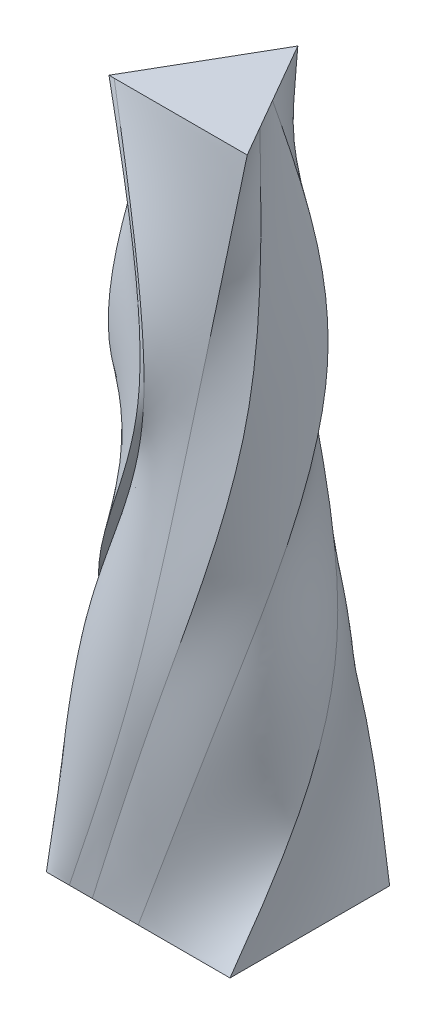
ISO-10303-21;
HEADER;
FILE_DESCRIPTION(('STEP AP214'),'2;1');
FILE_NAME('part.step','',(''),(''),'','','');
FILE_SCHEMA(('AUTOMOTIVE_DESIGN { 1 0 10303 214 1 1 1 1 }'));
ENDSEC;
DATA;
#1=APPLICATION_CONTEXT('core data for automotive mechanical design processes');
#2=APPLICATION_PROTOCOL_DEFINITION('international standard','automotive_design',2000,#1);
#3=PRODUCT_CONTEXT('',#1,'mechanical');
#4=PRODUCT('Part','Part','',(#3));
#5=PRODUCT_RELATED_PRODUCT_CATEGORY('part','',(#4));
#6=PRODUCT_DEFINITION_FORMATION('','',#4);
#7=PRODUCT_DEFINITION_CONTEXT('part definition',#1,'design');
#8=PRODUCT_DEFINITION('design','',#6,#7);
#9=PRODUCT_DEFINITION_SHAPE('','',#8);
#10=(LENGTH_UNIT() NAMED_UNIT(*) SI_UNIT(.MILLI.,.METRE.));
#11=(NAMED_UNIT(*) PLANE_ANGLE_UNIT() SI_UNIT($,.RADIAN.));
#12=(NAMED_UNIT(*) SI_UNIT($,.STERADIAN.) SOLID_ANGLE_UNIT());
#13=UNCERTAINTY_MEASURE_WITH_UNIT(LENGTH_MEASURE(1.E-05),#10,'distance_accuracy_value','');
#14=(GEOMETRIC_REPRESENTATION_CONTEXT(3) GLOBAL_UNCERTAINTY_ASSIGNED_CONTEXT((#13)) GLOBAL_UNIT_ASSIGNED_CONTEXT((#10,
#11,#12)) REPRESENTATION_CONTEXT('',''));
#15=CARTESIAN_POINT('',(0.,0.,0.));
#16=DIRECTION('',(0.,0.,1.));
#17=DIRECTION('',(1.,0.,0.));
#18=AXIS2_PLACEMENT_3D('',#15,#16,#17);
#19=CARTESIAN_POINT('',(0.,300.,0.));
#20=DIRECTION('',(0.,1.,0.));
#21=DIRECTION('',(0.,0.,1.));
#22=AXIS2_PLACEMENT_3D('',#19,#20,#21);
#23=PLANE('',#22);
#24=DIRECTION('',(1.,0.,0.));
#25=VECTOR('',#24,1.);
#26=CARTESIAN_POINT('',(-30.4293232964208,300.,17.5683779964472));
#27=LINE('',#26,#25);
#28=CARTESIAN_POINT('',(-30.4293232964208,300.,17.5683779964472));
#29=VERTEX_POINT('',#28);
#30=CARTESIAN_POINT('',(-28.1470310687837,300.,17.5683779964472));
#31=VERTEX_POINT('',#30);
#32=EDGE_CURVE('E78',#29,#31,#27,.T.);
#33=ORIENTED_EDGE('',*,*,#32,.T.);
#34=CARTESIAN_POINT('',(30.4293232964211,300.,17.5683779964468));
#35=VERTEX_POINT('',#34);
#36=EDGE_CURVE('E505',#31,#35,#27,.T.);
#37=ORIENTED_EDGE('',*,*,#36,.T.);
#38=DIRECTION('',(-0.500000000000004,0.,-0.866025403784436));
#39=VECTOR('',#38,1.);
#40=CARTESIAN_POINT('',(30.4293232964211,300.,17.5683779964468));
#41=LINE('',#40,#39);
#42=CARTESIAN_POINT('',(22.8219924723157,300.,4.39209449911165));
#43=VERTEX_POINT('',#42);
#44=EDGE_CURVE('E330',#35,#43,#41,.T.);
#45=ORIENTED_EDGE('',*,*,#44,.T.);
#46=CARTESIAN_POINT('',(15.2146616482104,300.,-8.78418899822345));
#47=VERTEX_POINT('',#46);
#48=EDGE_CURVE('E86',#43,#47,#41,.T.);
#49=ORIENTED_EDGE('',*,*,#48,.T.);
#50=CARTESIAN_POINT('',(-2.39391839684799E-13,300.,-35.1367559928937));
#51=VERTEX_POINT('',#50);
#52=EDGE_CURVE('E354',#47,#51,#41,.T.);
#53=ORIENTED_EDGE('',*,*,#52,.T.);
#54=DIRECTION('',(-0.499999999999992,0.,0.866025403784443));
#55=VECTOR('',#54,1.);
#56=CARTESIAN_POINT('',(-2.39391839684799E-13,300.,-35.1367559928937));
#57=LINE('',#56,#55);
#58=CARTESIAN_POINT('',(-10.1431077654738,300.,-17.5683779964467));
#59=VERTEX_POINT('',#58);
#60=EDGE_CURVE('E12',#51,#59,#57,.T.);
#61=ORIENTED_EDGE('',*,*,#60,.T.);
#62=CARTESIAN_POINT('',(-20.2862155309473,300.,2.56739074444567E-13));
#63=VERTEX_POINT('',#62);
#64=EDGE_CURVE('E70',#59,#63,#57,.T.);
#65=ORIENTED_EDGE('',*,*,#64,.T.);
#66=EDGE_CURVE('E499',#63,#29,#57,.T.);
#67=ORIENTED_EDGE('',*,*,#66,.T.);
#68=EDGE_LOOP('',(#33,#37,#45,#49,#53,#61,#65,#67));
#69=FACE_BOUND('',#68,.T.);
#70=ADVANCED_FACE('F59',(#69),#23,.T.);
#71=CARTESIAN_POINT('',(0.,0.,0.));
#72=DIRECTION('',(0.,1.,0.));
#73=DIRECTION('',(0.,0.,1.));
#74=AXIS2_PLACEMENT_3D('',#71,#72,#73);
#75=PLANE('',#74);
#76=DIRECTION('',(0.,0.,-1.));
#77=VECTOR('',#76,1.);
#78=CARTESIAN_POINT('',(40.4276188644105,0.,-35.1367559928937));
#79=LINE('',#78,#77);
#80=CARTESIAN_POINT('',(40.4276188644105,0.,35.1367559928937));
#81=VERTEX_POINT('',#80);
#82=CARTESIAN_POINT('',(40.4276188644105,0.,-35.1367559928937));
#83=VERTEX_POINT('',#82);
#84=EDGE_CURVE('E136',#81,#83,#79,.T.);
#85=ORIENTED_EDGE('',*,*,#84,.F.);
#86=DIRECTION('',(1.,0.,0.));
#87=VECTOR('',#86,1.);
#88=CARTESIAN_POINT('',(-40.4276188644105,0.,35.1367559928937));
#89=LINE('',#88,#87);
#90=CARTESIAN_POINT('',(0.,0.,35.1367559928937));
#91=VERTEX_POINT('',#90);
#92=EDGE_CURVE('E159',#91,#81,#89,.T.);
#93=ORIENTED_EDGE('',*,*,#92,.F.);
#94=CARTESIAN_POINT('',(-20.2138094322052,0.,35.1367559928937));
#95=VERTEX_POINT('',#94);
#96=EDGE_CURVE('E415',#95,#91,#89,.T.);
#97=ORIENTED_EDGE('',*,*,#96,.F.);
#98=CARTESIAN_POINT('',(-30.3207141483079,0.,35.1367559928937));
#99=VERTEX_POINT('',#98);
#100=EDGE_CURVE('E434',#99,#95,#89,.T.);
#101=ORIENTED_EDGE('',*,*,#100,.F.);
#102=CARTESIAN_POINT('',(-40.4276188644105,0.,35.1367559928937));
#103=VERTEX_POINT('',#102);
#104=EDGE_CURVE('E294',#103,#99,#89,.T.);
#105=ORIENTED_EDGE('',*,*,#104,.F.);
#106=DIRECTION('',(0.,0.,1.));
#107=VECTOR('',#106,1.);
#108=CARTESIAN_POINT('',(-40.4276188644105,0.,-35.1367559928937));
#109=LINE('',#108,#107);
#110=CARTESIAN_POINT('',(-40.4276188644105,0.,-35.1367559928937));
#111=VERTEX_POINT('',#110);
#112=EDGE_CURVE('E547',#111,#103,#109,.T.);
#113=ORIENTED_EDGE('',*,*,#112,.F.);
#114=DIRECTION('',(-1.,0.,0.));
#115=VECTOR('',#114,1.);
#116=CARTESIAN_POINT('',(-40.4276188644105,0.,-35.1367559928937));
#117=LINE('',#116,#115);
#118=CARTESIAN_POINT('',(0.,0.,-35.1367559928937));
#119=VERTEX_POINT('',#118);
#120=EDGE_CURVE('E139',#119,#111,#117,.T.);
#121=ORIENTED_EDGE('',*,*,#120,.F.);
#122=EDGE_CURVE('E131',#83,#119,#117,.T.);
#123=ORIENTED_EDGE('',*,*,#122,.F.);
#124=EDGE_LOOP('',(#85,#93,#97,#101,#105,#113,#121,#123));
#125=FACE_BOUND('',#124,.T.);
#126=ADVANCED_FACE('F134',(#125),#75,.F.);
#127=CARTESIAN_POINT('',(-40.4276188644105,0.,35.1367559928937));
#128=CARTESIAN_POINT('',(-43.8053402258569,33.5499719958289,25.0502257336181));
#129=CARTESIAN_POINT('',(-50.6027444606396,101.066708078416,4.75186001250216));
#130=CARTESIAN_POINT('',(21.7624046226934,197.09049255232,45.6886245688639));
#131=CARTESIAN_POINT('',(-11.7740665819999,266.240177083769,26.7933229815175));
#132=CARTESIAN_POINT('',(-28.1470310687837,300.,17.5683779964472));
#133=CARTESIAN_POINT('',(-39.5853768047353,0.,35.1367559928937));
#134=CARTESIAN_POINT('',(-42.4105000082445,33.5499719958289,27.242958904826));
#135=CARTESIAN_POINT('',(-48.0958429872443,101.066708078416,11.3572999018671));
#136=CARTESIAN_POINT('',(21.6850121673204,197.09049255232,43.0729643908746));
#137=CARTESIAN_POINT('',(-8.5194406992081,266.240177083769,25.9352465354432));
#138=CARTESIAN_POINT('',(-23.2656682050166,300.,17.5683779964471));
#139=CARTESIAN_POINT('',(-37.9008926853849,0.,35.1367559928937));
#140=CARTESIAN_POINT('',(-39.0030385483316,33.5499719958288,31.2071557101047));
#141=CARTESIAN_POINT('',(-41.2210222581939,101.066708078416,23.2991376278212));
#142=CARTESIAN_POINT('',(21.0876159347266,197.09049255232,38.1434640313594));
#143=CARTESIAN_POINT('',(-2.15538912179847,266.24017708377,24.3181067460284));
#144=CARTESIAN_POINT('',(-13.5029424774825,300.,17.5683779964471));
#145=CARTESIAN_POINT('',(-35.3741665063591,0.,35.1367559928936));
#146=CARTESIAN_POINT('',(-32.4624064111252,33.5499719958289,35.6461743453816));
#147=CARTESIAN_POINT('',(-26.6027133565331,101.066708078416,36.671339566528));
#148=CARTESIAN_POINT('',(19.1673944609987,197.09049255232,31.8291069325555));
#149=CARTESIAN_POINT('',(7.05471976836362,266.240177083769,22.2466598722412));
#150=CARTESIAN_POINT('',(1.14114611381868,300.,17.5683779964469));
#151=CARTESIAN_POINT('',(-32.8474403273336,0.,35.1367559928937));
#152=CARTESIAN_POINT('',(-24.9162374533098,33.5499719958287,38.3344484467875));
#153=CARTESIAN_POINT('',(-8.95530218548026,101.066708078416,44.7695583631138));
#154=CARTESIAN_POINT('',(16.5267527031401,197.09049255232,26.7690767252997));
#155=CARTESIAN_POINT('',(16.028492271143,266.24017708377,20.5866993109239));
#156=CARTESIAN_POINT('',(15.7852347051199,300.,17.5683779964469));
#157=CARTESIAN_POINT('',(-31.1629562079831,0.,35.1367559928937));
#158=CARTESIAN_POINT('',(-19.4977023521787,33.5499719958289,38.7971561843239));
#159=CARTESIAN_POINT('',(3.9777230823536,101.066708078416,46.1634298048257));
#160=CARTESIAN_POINT('',(14.4885159022849,197.09049255232,24.3482301488806));
#161=CARTESIAN_POINT('',(21.9198710737873,266.240177083769,19.7925321464485));
#162=CARTESIAN_POINT('',(25.547960432654,300.,17.5683779964468));
#163=CARTESIAN_POINT('',(-30.3207141483079,0.,35.1367559928937));
#164=CARTESIAN_POINT('',(-16.7621463737542,33.5499719958289,38.6555633103703));
#165=CARTESIAN_POINT('',(10.5234275816046,101.066708078416,45.7368921713626));
#166=CARTESIAN_POINT('',(13.4505630680709,197.09049255232,23.4050058262889));
#167=CARTESIAN_POINT('',(24.8593817734023,266.240177083769,19.4831041170007));
#168=CARTESIAN_POINT('',(30.4293232964211,300.,17.5683779964468));
#169=B_SPLINE_SURFACE_WITH_KNOTS('',3,3,((#127,#128,#129,#130,#131,#132),(#133,#134,#135,#136,
#137,#138),(#139,#140,#141,#142,#143,#144),(#145,#146,#147,#148,#149,#150),(#151,#152,#153,#154,
#155,#156),(#157,#158,#159,#160,#161,#162),(#163,#164,#165,#166,#167,#168)),.UNSPECIFIED.,.F.,
.F.,.F.,(4,1,1,1,4),(4,1,1,4),(0.,0.25,0.5,0.75,1.),(0.,0.335771666112832,0.675714631528431,1.),.UNSPECIFIED.);
#170=CARTESIAN_POINT('',(-30.3207141483079,0.,35.1367559928937));
#171=CARTESIAN_POINT('',(-16.7621463737542,33.5499719958289,38.6555633103703));
#172=CARTESIAN_POINT('',(10.5234275816046,101.066708078416,45.7368921713626));
#173=CARTESIAN_POINT('',(13.4505630680709,197.09049255232,23.4050058262889));
#174=CARTESIAN_POINT('',(24.8593817734023,266.240177083769,19.4831041170007));
#175=CARTESIAN_POINT('',(30.4293232964211,300.,17.5683779964468));
#176=B_SPLINE_CURVE_WITH_KNOTS('',3,(#170,#171,#172,#173,#174,#175),.UNSPECIFIED.,.F.,.F.,(4,1,
1,4),(0.,0.335771666112832,0.675714631528431,1.),.UNSPECIFIED.);
#177=EDGE_CURVE('E283',#99,#35,#176,.T.);
#178=CARTESIAN_POINT('',(-40.4276188644105,0.,35.1367559928937));
#179=CARTESIAN_POINT('',(-43.8053402258569,33.5499719958289,25.0502257336181));
#180=CARTESIAN_POINT('',(-50.6027444606396,101.066708078416,4.75186001250216));
#181=CARTESIAN_POINT('',(21.7624046226934,197.09049255232,45.6886245688639));
#182=CARTESIAN_POINT('',(-11.7740665819999,266.240177083769,26.7933229815175));
#183=CARTESIAN_POINT('',(-28.1470310687837,300.,17.5683779964472));
#184=B_SPLINE_CURVE_WITH_KNOTS('',3,(#178,#179,#180,#181,#182,#183),.UNSPECIFIED.,.F.,.F.,(4,1,
1,4),(0.,0.335771666112832,0.675714631528431,1.),.UNSPECIFIED.);
#185=EDGE_CURVE('E146',#31,#103,#184,.F.);
#186=ORIENTED_EDGE('',*,*,#104,.T.);
#187=ORIENTED_EDGE('',*,*,#177,.T.);
#188=ORIENTED_EDGE('',*,*,#36,.F.);
#189=ORIENTED_EDGE('',*,*,#185,.T.);
#190=EDGE_LOOP('',(#186,#187,#188,#189));
#191=FACE_BOUND('',#190,.T.);
#192=ADVANCED_FACE('F300',(#191),#169,.T.);
#193=CARTESIAN_POINT('',(-30.3207141483079,0.,35.1367559928937));
#194=CARTESIAN_POINT('',(-16.7621463737542,33.5499719958289,38.6555633103703));
#195=CARTESIAN_POINT('',(10.5234275816046,101.066708078416,45.7368921713626));
#196=CARTESIAN_POINT('',(13.4505630680709,197.09049255232,23.4050058262889));
#197=CARTESIAN_POINT('',(24.8593817734023,266.240177083769,19.4831041170007));
#198=CARTESIAN_POINT('',(30.4293232964211,300.,17.5683779964468));
#199=CARTESIAN_POINT('',(-29.4784720886326,0.,35.1367559928937));
#200=CARTESIAN_POINT('',(-15.9834279311039,33.5499719958289,38.6747879547878));
#201=CARTESIAN_POINT('',(11.1743096348172,101.066708078416,45.7948049328247));
#202=CARTESIAN_POINT('',(15.2727908657445,197.09049255232,22.6368708377133));
#203=CARTESIAN_POINT('',(25.0311933418042,266.240177083769,18.4933016101397));
#204=CARTESIAN_POINT('',(29.795379061079,300.,16.4703543716688));
#205=CARTESIAN_POINT('',(-27.7939879692822,0.,35.1367559928937));
#206=CARTESIAN_POINT('',(-14.43011458404,33.5499719958289,38.68271965563));
#207=CARTESIAN_POINT('',(12.46365189972,101.066708078416,45.8186985710572));
#208=CARTESIAN_POINT('',(18.9202007841231,197.09049255232,21.1224652905483));
#209=CARTESIAN_POINT('',(25.3757856545846,266.24017708377,16.5208692989484));
#210=CARTESIAN_POINT('',(28.5274905903947,300.,14.274307122113));
#211=CARTESIAN_POINT('',(-25.2672617902565,0.,35.1367559928936));
#212=CARTESIAN_POINT('',(-12.1169278597369,33.5499719958289,38.6041099294889));
#213=CARTESIAN_POINT('',(14.3471069089112,101.066708078416,45.581892822158));
#214=CARTESIAN_POINT('',(24.403340111553,197.09049255232,18.9157012173381));
#215=CARTESIAN_POINT('',(25.8966187864796,266.240177083769,13.5834932137739));
#216=CARTESIAN_POINT('',(26.6256578843684,300.,10.9802362477792));
#217=CARTESIAN_POINT('',(-22.7405356112309,0.,35.1367559928937));
#218=CARTESIAN_POINT('',(-9.8249371133096,33.5499719958289,38.4360384125176));
#219=CARTESIAN_POINT('',(16.1667106663436,101.066708078416,45.0755903148371));
#220=CARTESIAN_POINT('',(29.9016653696131,197.09049255232,16.7730323492441));
#221=CARTESIAN_POINT('',(26.4224337158936,266.240177083769,10.6671437842329));
#222=CARTESIAN_POINT('',(24.7238251783421,300.,7.68616537344543));
#223=CARTESIAN_POINT('',(-21.0560514918805,0.,35.1367559928937));
#224=CARTESIAN_POINT('',(-8.31401572199709,33.5499719958289,38.2650465316993));
#225=CARTESIAN_POINT('',(17.328350427729,101.066708078416,44.5604904362263));
#226=CARTESIAN_POINT('',(33.5794471492516,197.09049255232,15.3868172123114));
#227=CARTESIAN_POINT('',(26.776989623712,266.240177083769,8.73676478430828));
#228=CARTESIAN_POINT('',(23.4559367076578,300.,5.49011812388958));
#229=CARTESIAN_POINT('',(-20.2138094322052,0.,35.1367559928937));
#230=CARTESIAN_POINT('',(-7.56355858318109,33.5499719958289,38.1649887883431));
#231=CARTESIAN_POINT('',(17.8940974785967,101.066708078416,44.2590741864594));
#232=CARTESIAN_POINT('',(35.4219228544318,197.09049255232,14.704142497224));
#233=CARTESIAN_POINT('',(26.955443588806,266.240177083769,7.77499781829175));
#234=CARTESIAN_POINT('',(22.8219924723157,300.,4.39209449911165));
#235=B_SPLINE_SURFACE_WITH_KNOTS('',3,3,((#193,#194,#195,#196,#197,#198),(#199,#200,#201,#202,
#203,#204),(#205,#206,#207,#208,#209,#210),(#211,#212,#213,#214,#215,#216),(#217,#218,#219,#220,
#221,#222),(#223,#224,#225,#226,#227,#228),(#229,#230,#231,#232,#233,#234)),.UNSPECIFIED.,.F.,
.F.,.F.,(4,1,1,1,4),(4,1,1,4),(0.,0.25,0.5,0.75,1.),(0.,0.335771666112832,0.675714631528431,1.),.UNSPECIFIED.);
#236=CARTESIAN_POINT('',(-20.2138094322052,0.,35.1367559928937));
#237=CARTESIAN_POINT('',(-7.56355858318109,33.5499719958289,38.1649887883431));
#238=CARTESIAN_POINT('',(17.8940974785967,101.066708078416,44.2590741864594));
#239=CARTESIAN_POINT('',(35.4219228544318,197.09049255232,14.704142497224));
#240=CARTESIAN_POINT('',(26.955443588806,266.240177083769,7.77499781829175));
#241=CARTESIAN_POINT('',(22.8219924723157,300.,4.39209449911165));
#242=B_SPLINE_CURVE_WITH_KNOTS('',3,(#236,#237,#238,#239,#240,#241),.UNSPECIFIED.,.F.,.F.,(4,1,
1,4),(0.,0.335771666112832,0.675714631528431,1.),.UNSPECIFIED.);
#243=EDGE_CURVE('E404',#95,#43,#242,.T.);
#244=ORIENTED_EDGE('',*,*,#100,.T.);
#245=ORIENTED_EDGE('',*,*,#243,.T.);
#246=ORIENTED_EDGE('',*,*,#44,.F.);
#247=ORIENTED_EDGE('',*,*,#177,.F.);
#248=EDGE_LOOP('',(#244,#245,#246,#247));
#249=FACE_BOUND('',#248,.T.);
#250=ADVANCED_FACE('F255',(#249),#235,.T.);
#251=CARTESIAN_POINT('',(-40.4276188644105,0.,-35.1367559928937));
#252=CARTESIAN_POINT('',(-44.1756524121262,33.5499719958289,-16.9417704246869));
#253=CARTESIAN_POINT('',(-51.7182814164444,101.066708078416,19.6742374452399));
#254=CARTESIAN_POINT('',(20.3455507064214,197.09049255232,43.4591736619814));
#255=CARTESIAN_POINT('',(-13.7724487525273,266.240177083769,26.0619438341142));
#256=CARTESIAN_POINT('',(-30.4293232964208,300.,17.5683779964472));
#257=CARTESIAN_POINT('',(-40.4276188644105,0.,-29.2806299940781));
#258=CARTESIAN_POINT('',(-44.1479621055965,33.5499719958289,-13.4408275411091));
#259=CARTESIAN_POINT('',(-51.6348664995263,101.066708078416,18.4355556031268));
#260=CARTESIAN_POINT('',(20.4658923372921,197.09049255232,43.6438078404272));
#261=CARTESIAN_POINT('',(-13.6051720689918,266.240177083769,26.1225137204464));
#262=CARTESIAN_POINT('',(-30.2391322774511,300.,17.5683779964472));
#263=CARTESIAN_POINT('',(-40.4276188644105,0.,-17.5683779964468));
#264=CARTESIAN_POINT('',(-44.091099548199,33.5499719958289,-6.4399927808854));
#265=CARTESIAN_POINT('',(-51.4635724224463,101.066708078416,15.9550258414204));
#266=CARTESIAN_POINT('',(20.7055138549588,197.09049255232,44.0138291948193));
#267=CARTESIAN_POINT('',(-13.2709670107684,266.24017708377,26.2439005165678));
#268=CARTESIAN_POINT('',(-29.8587502395116,300.,17.5683779964472));
#269=CARTESIAN_POINT('',(-40.4276188644104,0.,0.));
#270=CARTESIAN_POINT('',(-44.0011290812323,33.5499719958289,4.05866000006692));
#271=CARTESIAN_POINT('',(-51.1925433163198,101.066708078416,12.2264008288086));
#272=CARTESIAN_POINT('',(21.0615955433239,197.09049255232,44.5707235463016));
#273=CARTESIAN_POINT('',(-12.7707585955594,266.240177083769,26.4265916512877));
#274=CARTESIAN_POINT('',(-29.2881771826022,300.,17.5683779964471));
#275=CARTESIAN_POINT('',(-40.4276188644105,0.,17.5683779964468));
#276=CARTESIAN_POINT('',(-43.9062511855392,33.5499719958289,14.5552670830495));
#277=CARTESIAN_POINT('',(-50.9067309589113,101.066708078416,8.49161330853348));
#278=CARTESIAN_POINT('',(21.4141612876429,197.09049255232,45.1290835450707));
#279=CARTESIAN_POINT('',(-12.2717035980601,266.240177083769,26.6097635967131));
#280=CARTESIAN_POINT('',(-28.717604125693,300.,17.5683779964472));
#281=CARTESIAN_POINT('',(-40.4276188644105,0.,29.2806299940781));
#282=CARTESIAN_POINT('',(-43.8395737706886,33.5499719958289,21.5520104473334));
#283=CARTESIAN_POINT('',(-50.7058703792672,101.066708078416,5.99875853149997));
#284=CARTESIAN_POINT('',(21.6467509172175,197.09049255232,45.5020361940359));
#285=CARTESIAN_POINT('',(-11.9398053752559,266.240177083769,26.7321120142449));
#286=CARTESIAN_POINT('',(-28.3372220877535,300.,17.5683779964472));
#287=CARTESIAN_POINT('',(-40.4276188644105,0.,35.1367559928937));
#288=CARTESIAN_POINT('',(-43.8053402258569,33.5499719958289,25.0502257336181));
#289=CARTESIAN_POINT('',(-50.6027444606396,101.066708078416,4.75186001250216));
#290=CARTESIAN_POINT('',(21.7624046226934,197.09049255232,45.6886245688639));
#291=CARTESIAN_POINT('',(-11.7740665819999,266.240177083769,26.7933229815175));
#292=CARTESIAN_POINT('',(-28.1470310687837,300.,17.5683779964472));
#293=B_SPLINE_SURFACE_WITH_KNOTS('',3,3,((#251,#252,#253,#254,#255,#256),(#257,#258,#259,#260,
#261,#262),(#263,#264,#265,#266,#267,#268),(#269,#270,#271,#272,#273,#274),(#275,#276,#277,#278,
#279,#280),(#281,#282,#283,#284,#285,#286),(#287,#288,#289,#290,#291,#292)),.UNSPECIFIED.,.F.,
.F.,.F.,(4,1,1,1,4),(4,1,1,4),(0.,0.25,0.5,0.75,1.),(0.,0.335771666112832,0.675714631528431,1.),.UNSPECIFIED.);
#294=CARTESIAN_POINT('',(-40.4276188644105,0.,-35.1367559928937));
#295=CARTESIAN_POINT('',(-44.1756524121262,33.5499719958289,-16.9417704246869));
#296=CARTESIAN_POINT('',(-51.7182814164444,101.066708078416,19.6742374452399));
#297=CARTESIAN_POINT('',(20.3455507064214,197.09049255232,43.4591736619814));
#298=CARTESIAN_POINT('',(-13.7724487525273,266.240177083769,26.0619438341142));
#299=CARTESIAN_POINT('',(-30.4293232964208,300.,17.5683779964472));
#300=B_SPLINE_CURVE_WITH_KNOTS('',3,(#294,#295,#296,#297,#298,#299),.UNSPECIFIED.,.F.,.F.,(4,1,
1,4),(0.,0.335771666112832,0.675714631528431,1.),.UNSPECIFIED.);
#301=EDGE_CURVE('E171',#111,#29,#300,.T.);
#302=ORIENTED_EDGE('',*,*,#112,.T.);
#303=ORIENTED_EDGE('',*,*,#185,.F.);
#304=ORIENTED_EDGE('',*,*,#32,.F.);
#305=ORIENTED_EDGE('',*,*,#301,.F.);
#306=EDGE_LOOP('',(#302,#303,#304,#305));
#307=FACE_BOUND('',#306,.T.);
#308=ADVANCED_FACE('F242',(#307),#293,.T.);
#309=CARTESIAN_POINT('',(-20.2138094322052,0.,35.1367559928937));
#310=CARTESIAN_POINT('',(-7.56355858318109,33.5499719958289,38.1649887883431));
#311=CARTESIAN_POINT('',(17.8940974785967,101.066708078416,44.2590741864594));
#312=CARTESIAN_POINT('',(35.4219228544318,197.09049255232,14.704142497224));
#313=CARTESIAN_POINT('',(26.955443588806,266.240177083769,7.77499781829175));
#314=CARTESIAN_POINT('',(22.8219924723157,300.,4.39209449911165));
#315=CARTESIAN_POINT('',(-18.5293253128548,0.,35.1367559928937));
#316=CARTESIAN_POINT('',(-5.72299062160961,33.5499719958289,38.1940360001735));
#317=CARTESIAN_POINT('',(20.048772157852,101.066708078416,44.3465766761463));
#318=CARTESIAN_POINT('',(35.0770794180253,197.09049255232,10.575032716777));
#319=CARTESIAN_POINT('',(26.4163398790778,266.240177083769,5.68261580625546));
#320=CARTESIAN_POINT('',(22.1880482369736,300.,3.29407087433373));
#321=CARTESIAN_POINT('',(-15.160357074154,0.,35.1367559928937));
#322=CARTESIAN_POINT('',(-2.09372660816902,33.549971995829,38.1390349057648));
#323=CARTESIAN_POINT('',(24.2018613813017,101.066708078416,44.180890113031));
#324=CARTESIAN_POINT('',(34.4245563518082,197.09049255232,2.39784082547368));
#325=CARTESIAN_POINT('',(25.3503241760205,266.24017708377,1.52443319185574));
#326=CARTESIAN_POINT('',(20.9201597662894,300.,1.09802362477788));
#327=CARTESIAN_POINT('',(-10.1069047161026,0.,35.1367559928936));
#328=CARTESIAN_POINT('',(3.16518755862513,33.5499719958287,37.7384489670625));
#329=CARTESIAN_POINT('',(29.8742516224623,101.066708078416,42.9741558083892));
#330=CARTESIAN_POINT('',(33.5783026321382,197.09049255232,-9.64005443212486));
#331=CARTESIAN_POINT('',(23.7947778388372,266.240177083769,-4.63807977408668));
#332=CARTESIAN_POINT('',(19.0183270602631,300.,-2.1960472495559));
#333=CARTESIAN_POINT('',(-5.05345235805132,0.,35.1367559928937));
#334=CARTESIAN_POINT('',(8.209753747793,33.5499719958289,37.0409809883917));
#335=CARTESIAN_POINT('',(34.9009350807784,101.066708078416,40.8730872112788));
#336=CARTESIAN_POINT('',(32.8856192519917,197.09049255232,-21.4652475397833));
#337=CARTESIAN_POINT('',(22.2896107872621,266.240177083769,-10.7308150577335));
#338=CARTESIAN_POINT('',(17.1164943542367,300.,-5.49011812388968));
#339=CARTESIAN_POINT('',(-1.68448411935044,0.,35.1367559928937));
#340=CARTESIAN_POINT('',(11.4103218059809,33.5499719958289,36.3922158140453));
#341=CARTESIAN_POINT('',(37.7626107385385,101.066708078416,38.9187320632249));
#342=CARTESIAN_POINT('',(32.5402368648218,197.09049255232,-29.2170351312061));
#343=CARTESIAN_POINT('',(21.3243536554211,266.240177083769,-14.749442307542));
#344=CARTESIAN_POINT('',(15.8486058835525,300.,-7.68616537344553));
#345=CARTESIAN_POINT('',(0.,0.,35.1367559928937));
#346=CARTESIAN_POINT('',(12.9650924640506,33.5499719958289,36.0254203059173));
#347=CARTESIAN_POINT('',(39.0563430406674,101.066708078416,37.8137888296196));
#348=CARTESIAN_POINT('',(32.4001538811134,197.09049255232,-33.0625420450661));
#349=CARTESIAN_POINT('',(20.8524223265037,266.240177083769,-16.7487874098508));
#350=CARTESIAN_POINT('',(15.2146616482104,300.,-8.78418899822345));
#351=B_SPLINE_SURFACE_WITH_KNOTS('',3,3,((#309,#310,#311,#312,#313,#314),(#315,#316,#317,#318,
#319,#320),(#321,#322,#323,#324,#325,#326),(#327,#328,#329,#330,#331,#332),(#333,#334,#335,#336,
#337,#338),(#339,#340,#341,#342,#343,#344),(#345,#346,#347,#348,#349,#350)),.UNSPECIFIED.,.F.,
.F.,.F.,(4,1,1,1,4),(4,1,1,4),(0.,0.25,0.5,0.75,1.),(0.,0.335771666112832,0.675714631528431,1.),.UNSPECIFIED.);
#352=CARTESIAN_POINT('',(0.,0.,35.1367559928937));
#353=CARTESIAN_POINT('',(12.9650924640506,33.5499719958289,36.0254203059173));
#354=CARTESIAN_POINT('',(39.0563430406674,101.066708078416,37.8137888296196));
#355=CARTESIAN_POINT('',(32.4001538811134,197.09049255232,-33.0625420450661));
#356=CARTESIAN_POINT('',(20.8524223265037,266.240177083769,-16.7487874098508));
#357=CARTESIAN_POINT('',(15.2146616482104,300.,-8.78418899822345));
#358=B_SPLINE_CURVE_WITH_KNOTS('',3,(#352,#353,#354,#355,#356,#357),.UNSPECIFIED.,.F.,.F.,(4,1,
1,4),(0.,0.335771666112832,0.675714631528431,1.),.UNSPECIFIED.);
#359=EDGE_CURVE('E173',#91,#47,#358,.T.);
#360=ORIENTED_EDGE('',*,*,#96,.T.);
#361=ORIENTED_EDGE('',*,*,#359,.T.);
#362=ORIENTED_EDGE('',*,*,#48,.F.);
#363=ORIENTED_EDGE('',*,*,#243,.F.);
#364=EDGE_LOOP('',(#360,#361,#362,#363));
#365=FACE_BOUND('',#364,.T.);
#366=ADVANCED_FACE('F254',(#365),#351,.T.);
#367=CARTESIAN_POINT('',(0.,0.,35.1367559928937));
#368=CARTESIAN_POINT('',(12.9650924640506,33.5499719958289,36.0254203059173));
#369=CARTESIAN_POINT('',(39.0563430406674,101.066708078416,37.8137888296196));
#370=CARTESIAN_POINT('',(32.4001538811134,197.09049255232,-33.0625420450661));
#371=CARTESIAN_POINT('',(20.8524223265037,266.240177083769,-16.7487874098508));
#372=CARTESIAN_POINT('',(15.2146616482104,300.,-8.78418899822345));
#373=CARTESIAN_POINT('',(3.36896823870087,0.,35.1367559928937));
#374=CARTESIAN_POINT('',(16.4334183976483,33.5499719958289,34.6809314145583));
#375=CARTESIAN_POINT('',(42.7246186870385,101.066708078416,33.7636195384335));
#376=CARTESIAN_POINT('',(28.053630567424,197.09049255232,-33.7179664070249));
#377=CARTESIAN_POINT('',(18.5745769558078,266.240177083769,-18.4394279466944));
#378=CARTESIAN_POINT('',(13.9467731775262,300.,-10.9802362477793));
#379=CARTESIAN_POINT('',(10.1069047161026,0.,35.1367559928937));
#380=CARTESIAN_POINT('',(22.9271456599813,33.5499719958288,31.72468532734));
#381=CARTESIAN_POINT('',(48.7268937024132,101.066708078416,24.8581557621301));
#382=CARTESIAN_POINT('',(19.6779187836268,197.09049255232,-34.8373298427653));
#383=CARTESIAN_POINT('',(14.1229890168699,266.24017708377,-21.7578916036019));
#384=CARTESIAN_POINT('',(11.4109962361578,300.,-15.372330746891));
#385=CARTESIAN_POINT('',(20.2138094322052,0.,35.1367559928936));
#386=CARTESIAN_POINT('',(31.2927606718792,33.5499719958289,26.7746947430546));
#387=CARTESIAN_POINT('',(53.5882972229654,101.066708078416,9.94669015986141));
#388=CARTESIAN_POINT('',(8.09945726714271,197.09049255232,-36.1469562477127));
#389=CARTESIAN_POINT('',(7.76877462051807,266.240177083769,-26.6143979797535));
#390=CARTESIAN_POINT('',(7.60733082410508,300.,-21.9604724955586));
#391=CARTESIAN_POINT('',(30.3207141483079,0.,35.1367559928937));
#392=CARTESIAN_POINT('',(38.2371977351621,33.5499719958287,21.5952661653538));
#393=CARTESIAN_POINT('',(54.1685115706021,101.066708078416,-5.65593973624015));
#394=CARTESIAN_POINT('',(-2.46079646166299,197.09049255232,-37.2922010198657));
#395=CARTESIAN_POINT('',(1.74858684091425,266.24017708377,-31.4169783878244));
#396=CARTESIAN_POINT('',(3.80366541205243,300.,-28.5486142442261));
#397=CARTESIAN_POINT('',(37.0586506257096,0.,35.1367559928937));
#398=CARTESIAN_POINT('',(41.8885691002643,33.5499719958289,18.1801440913047));
#399=CARTESIAN_POINT('',(51.6084082401438,101.066708078416,-15.9437321002095));
#400=CARTESIAN_POINT('',(-8.80009267010288,197.09049255232,-38.082801190017));
#401=CARTESIAN_POINT('',(-2.03494786452752,266.240177083769,-34.6275901085706));
#402=CARTESIAN_POINT('',(1.26788847068398,300.,-32.9407087433378));
#403=CARTESIAN_POINT('',(40.4276188644105,0.,35.1367559928937));
#404=CARTESIAN_POINT('',(43.4619911023748,33.5499719958289,16.5297378753918));
#405=CARTESIAN_POINT('',(49.5684316559597,101.066708078416,-20.9154537831729));
#406=CARTESIAN_POINT('',(-11.7890056002207,197.09049255232,-38.5190500415832));
#407=CARTESIAN_POINT('',(-3.86742441289271,266.240177083769,-36.24632935464));
#408=CARTESIAN_POINT('',(-2.42861286636753E-13,300.,-35.1367559928937));
#409=B_SPLINE_SURFACE_WITH_KNOTS('',3,3,((#367,#368,#369,#370,#371,#372),(#373,#374,#375,#376,
#377,#378),(#379,#380,#381,#382,#383,#384),(#385,#386,#387,#388,#389,#390),(#391,#392,#393,#394,
#395,#396),(#397,#398,#399,#400,#401,#402),(#403,#404,#405,#406,#407,#408)),.UNSPECIFIED.,.F.,
.F.,.F.,(4,1,1,1,4),(4,1,1,4),(0.,0.25,0.5,0.75,1.),(0.,0.335771666112832,0.675714631528431,1.),.UNSPECIFIED.);
#410=CARTESIAN_POINT('',(40.4276188644105,0.,35.1367559928937));
#411=CARTESIAN_POINT('',(43.4619911023748,33.5499719958289,16.5297378753918));
#412=CARTESIAN_POINT('',(49.5684316559597,101.066708078416,-20.9154537831729));
#413=CARTESIAN_POINT('',(-11.7890056002207,197.09049255232,-38.5190500415832));
#414=CARTESIAN_POINT('',(-3.86742441289271,266.240177083769,-36.24632935464));
#415=CARTESIAN_POINT('',(-2.42861286636753E-13,300.,-35.1367559928937));
#416=B_SPLINE_CURVE_WITH_KNOTS('',3,(#410,#411,#412,#413,#414,#415),.UNSPECIFIED.,.F.,.F.,(4,1,
1,4),(0.,0.335771666112832,0.675714631528431,1.),.UNSPECIFIED.);
#417=EDGE_CURVE('E157',#81,#51,#416,.T.);
#418=ORIENTED_EDGE('',*,*,#92,.T.);
#419=ORIENTED_EDGE('',*,*,#417,.T.);
#420=ORIENTED_EDGE('',*,*,#52,.F.);
#421=ORIENTED_EDGE('',*,*,#359,.F.);
#422=EDGE_LOOP('',(#418,#419,#420,#421));
#423=FACE_BOUND('',#422,.T.);
#424=ADVANCED_FACE('F360',(#423),#409,.T.);
#425=CARTESIAN_POINT('',(40.4276188644105,0.,35.1367559928937));
#426=CARTESIAN_POINT('',(43.4619911023748,33.5499719958289,16.5297378753918));
#427=CARTESIAN_POINT('',(49.5684316559597,101.066708078416,-20.9154537831729));
#428=CARTESIAN_POINT('',(-11.7890056002208,197.09049255232,-38.5190500415832));
#429=CARTESIAN_POINT('',(-3.86742441289271,266.240177083769,-36.24632935464));
#430=CARTESIAN_POINT('',(-2.39391839684799E-13,300.,-35.1367559928937));
#431=CARTESIAN_POINT('',(40.4276188644105,0.,29.2806299940781));
#432=CARTESIAN_POINT('',(43.0975557022642,33.5499719958289,11.1892689563957));
#433=CARTESIAN_POINT('',(48.4705980660836,101.066708078416,-25.2182025225034));
#434=CARTESIAN_POINT('',(-15.1137306089929,197.09049255232,-35.6834882702523));
#435=CARTESIAN_POINT('',(-5.52608087351184,266.240177083769,-34.3323625647694));
#436=CARTESIAN_POINT('',(-0.845258980456368,300.,-33.6727244931897));
#437=CARTESIAN_POINT('',(40.4276188644105,0.,17.5683779964468));
#438=CARTESIAN_POINT('',(41.9157614582882,33.5499719958288,0.758280925925357));
#439=CARTESIAN_POINT('',(44.9105338764765,101.066708078416,-33.0707454462628));
#440=CARTESIAN_POINT('',(-21.438682080734,197.09049255232,-30.1914421195497));
#441=CARTESIAN_POINT('',(-8.73694091479185,266.24017708377,-30.5631759481689));
#442=CARTESIAN_POINT('',(-2.53577694136863,300.,-30.7446614937819));
#443=CARTESIAN_POINT('',(40.4276188644104,0.,0.));
#444=CARTESIAN_POINT('',(39.0090408740926,33.5499719958289,-13.9552478034516));
#445=CARTESIAN_POINT('',(36.1542618657298,101.066708078416,-42.0391097819323));
#446=CARTESIAN_POINT('',(-30.1136301877631,197.09049255232,-22.6217904784658));
#447=CARTESIAN_POINT('',(-13.2866943734466,266.240177083769,-25.1286727437806));
#448=CARTESIAN_POINT('',(-5.071553882737,300.,-26.3525669946702));
#449=CARTESIAN_POINT('',(40.4276188644105,0.,-17.5683779964468));
#450=CARTESIAN_POINT('',(35.1930321846985,33.5499719958287,-27.552719322737));
#451=CARTESIAN_POINT('',(24.6588294318771,101.066708078416,-47.6454376823653));
#452=CARTESIAN_POINT('',(-38.1371157310376,197.09049255232,-15.8517418314456));
#453=CARTESIAN_POINT('',(-17.6227332654459,266.24017708377,-19.956482090996));
#454=CARTESIAN_POINT('',(-7.60733082410541,300.,-21.9604724955584));
#455=CARTESIAN_POINT('',(40.4276188644105,0.,-29.2806299940781));
#456=CARTESIAN_POINT('',(32.192661730325,33.5499719958289,-35.7515929330245));
#457=CARTESIAN_POINT('',(15.6204443960574,101.066708078416,-48.773907735653));
#458=CARTESIAN_POINT('',(-43.1591420752687,197.09049255232,-11.9589016688701));
#459=CARTESIAN_POINT('',(-20.4061641734148,266.240177083769,-16.7119205776027));
#460=CARTESIAN_POINT('',(-9.29784878501766,300.,-19.0324094961506));
#461=CARTESIAN_POINT('',(40.4276188644105,0.,-35.1367559928937));
#462=CARTESIAN_POINT('',(30.6158421899494,33.5499719958289,-39.6039855718988));
#463=CARTESIAN_POINT('',(10.8703969087064,101.066708078416,-48.5939412280022));
#464=CARTESIAN_POINT('',(-45.6152503323677,197.09049255232,-10.1894772229574));
#465=CARTESIAN_POINT('',(-21.7798678784931,266.240177083769,-15.147703856537));
#466=CARTESIAN_POINT('',(-10.1431077654738,300.,-17.5683779964467));
#467=B_SPLINE_SURFACE_WITH_KNOTS('',3,3,((#425,#426,#427,#428,#429,#430),(#431,#432,#433,#434,
#435,#436),(#437,#438,#439,#440,#441,#442),(#443,#444,#445,#446,#447,#448),(#449,#450,#451,#452,
#453,#454),(#455,#456,#457,#458,#459,#460),(#461,#462,#463,#464,#465,#466)),.UNSPECIFIED.,.F.,
.F.,.F.,(4,1,1,1,4),(4,1,1,4),(0.,0.25,0.5,0.75,1.),(0.,0.335771666112832,0.675714631528431,1.),.UNSPECIFIED.);
#468=CARTESIAN_POINT('',(40.4276188644105,0.,-35.1367559928937));
#469=CARTESIAN_POINT('',(30.6158421899494,33.5499719958289,-39.6039855718988));
#470=CARTESIAN_POINT('',(10.8703969087064,101.066708078416,-48.5939412280022));
#471=CARTESIAN_POINT('',(-45.6152503323677,197.09049255232,-10.1894772229574));
#472=CARTESIAN_POINT('',(-21.7798678784931,266.240177083769,-15.147703856537));
#473=CARTESIAN_POINT('',(-10.1431077654738,300.,-17.5683779964467));
#474=B_SPLINE_CURVE_WITH_KNOTS('',3,(#468,#469,#470,#471,#472,#473),.UNSPECIFIED.,.F.,.F.,(4,1,
1,4),(0.,0.335771666112832,0.675714631528431,1.),.UNSPECIFIED.);
#475=EDGE_CURVE('E156',#83,#59,#474,.T.);
#476=ORIENTED_EDGE('',*,*,#84,.T.);
#477=ORIENTED_EDGE('',*,*,#475,.T.);
#478=ORIENTED_EDGE('',*,*,#60,.F.);
#479=ORIENTED_EDGE('',*,*,#417,.F.);
#480=EDGE_LOOP('',(#476,#477,#478,#479));
#481=FACE_BOUND('',#480,.T.);
#482=ADVANCED_FACE('F154',(#481),#467,.T.);
#483=CARTESIAN_POINT('',(40.4276188644105,0.,-35.1367559928937));
#484=CARTESIAN_POINT('',(30.6158421899494,33.5499719958289,-39.6039855718988));
#485=CARTESIAN_POINT('',(10.8703969087064,101.066708078416,-48.5939412280022));
#486=CARTESIAN_POINT('',(-45.6152503323677,197.09049255232,-10.1894772229574));
#487=CARTESIAN_POINT('',(-21.7798678784931,266.240177083769,-15.147703856537));
#488=CARTESIAN_POINT('',(-10.1431077654738,300.,-17.5683779964467));
#489=CARTESIAN_POINT('',(37.0586506257096,0.,-35.1367559928937));
#490=CARTESIAN_POINT('',(26.7533449683348,33.5499719958289,-40.2657497655276));
#491=CARTESIAN_POINT('',(6.01471059910576,101.066708078416,-50.5874549210256));
#492=CARTESIAN_POINT('',(-44.236929314692,197.09049255232,-5.70382440107775));
#493=CARTESIAN_POINT('',(-21.8956736836421,266.240177083769,-12.6924189412202));
#494=CARTESIAN_POINT('',(-10.9883667459299,300.,-16.1043464967428));
#495=CARTESIAN_POINT('',(30.3207141483079,0.,-35.1367559928937));
#496=CARTESIAN_POINT('',(19.0183516862133,33.5499719958288,-41.0720600407632));
#497=CARTESIAN_POINT('',(-3.72678275258314,101.066708078416,-53.0164025582396));
#498=CARTESIAN_POINT('',(-41.4731235771191,197.09049255232,2.89691856254533));
#499=CARTESIAN_POINT('',(-22.1249352164359,266.24017708377,-7.90341349050657));
#500=CARTESIAN_POINT('',(-12.6788847068422,300.,-13.176283497335));
#501=CARTESIAN_POINT('',(20.2138094322052,0.,-35.1367559928936));
#502=CARTESIAN_POINT('',(7.65680842640074,33.5499719958289,-40.83295068383));
#503=CARTESIAN_POINT('',(-17.6131895039429,101.066708078416,-52.2961040262768));
#504=CARTESIAN_POINT('',(-37.5000420293889,197.09049255232,14.7601966743466));
#505=CARTESIAN_POINT('',(-22.5254584244163,266.240177083769,-1.06037114415847));
#506=CARTESIAN_POINT('',(-15.2146616482105,300.,-8.7841889982232));
#507=CARTESIAN_POINT('',(10.1069047161026,0.,-35.1367559928937));
#508=CARTESIAN_POINT('',(-3.19284498999513,33.5499719958287,-39.24834612339));
#509=CARTESIAN_POINT('',(-29.9575675054926,101.066708078416,-47.5226047652453));
#510=CARTESIAN_POINT('',(-33.8937057055826,197.09049255232,25.6594901592899));
#511=CARTESIAN_POINT('',(-23.0462936824893,266.24017708377,5.46643268250529));
#512=CARTESIAN_POINT('',(-17.7504385895789,300.,-4.39209449911148));
#513=CARTESIAN_POINT('',(3.36896823870087,0.,-35.1367559928937));
#514=CARTESIAN_POINT('',(-9.90405858528346,33.5499719958289,-37.3636659916119));
#515=CARTESIAN_POINT('',(-36.6150033575612,101.066708078416,-41.8451509443214));
#516=CARTESIAN_POINT('',(-31.863390415857,197.09049255232,32.3322638691968));
#517=CARTESIAN_POINT('',(-23.516179315468,266.240177083769,9.62296109385025));
#518=CARTESIAN_POINT('',(-19.4409565504912,300.,-1.46403149970365));
#519=CARTESIAN_POINT('',(0.,0.,-35.1367559928937));
#520=CARTESIAN_POINT('',(-13.0840360156759,33.5499719958289,-36.2314365805649));
#521=CARTESIAN_POINT('',(-39.4146513340816,101.066708078416,-38.4343969985862));
#522=CARTESIAN_POINT('',(-30.9740630300797,197.09049255232,35.5326038552656));
#523=CARTESIAN_POINT('',(-23.792401187407,266.240177083769,11.656594649588));
#524=CARTESIAN_POINT('',(-20.2862155309473,300.,2.63677968348475E-13));
#525=B_SPLINE_SURFACE_WITH_KNOTS('',3,3,((#483,#484,#485,#486,#487,#488),(#489,#490,#491,#492,
#493,#494),(#495,#496,#497,#498,#499,#500),(#501,#502,#503,#504,#505,#506),(#507,#508,#509,#510,
#511,#512),(#513,#514,#515,#516,#517,#518),(#519,#520,#521,#522,#523,#524)),.UNSPECIFIED.,.F.,
.F.,.F.,(4,1,1,1,4),(4,1,1,4),(0.,0.25,0.5,0.75,1.),(0.,0.335771666112832,0.675714631528431,1.),.UNSPECIFIED.);
#526=CARTESIAN_POINT('',(0.,0.,-35.1367559928937));
#527=CARTESIAN_POINT('',(-13.0840360156759,33.5499719958289,-36.2314365805649));
#528=CARTESIAN_POINT('',(-39.4146513340816,101.066708078416,-38.4343969985862));
#529=CARTESIAN_POINT('',(-30.9740630300797,197.09049255232,35.5326038552656));
#530=CARTESIAN_POINT('',(-23.792401187407,266.240177083769,11.656594649588));
#531=CARTESIAN_POINT('',(-20.2862155309473,300.,2.63677968348475E-13));
#532=B_SPLINE_CURVE_WITH_KNOTS('',3,(#526,#527,#528,#529,#530,#531),.UNSPECIFIED.,.F.,.F.,(4,1,
1,4),(0.,0.335771666112832,0.675714631528431,1.),.UNSPECIFIED.);
#533=EDGE_CURVE('E167',#119,#63,#532,.T.);
#534=ORIENTED_EDGE('',*,*,#122,.T.);
#535=ORIENTED_EDGE('',*,*,#533,.T.);
#536=ORIENTED_EDGE('',*,*,#64,.F.);
#537=ORIENTED_EDGE('',*,*,#475,.F.);
#538=EDGE_LOOP('',(#534,#535,#536,#537));
#539=FACE_BOUND('',#538,.T.);
#540=ADVANCED_FACE('F164',(#539),#525,.T.);
#541=CARTESIAN_POINT('',(0.,0.,-35.1367559928937));
#542=CARTESIAN_POINT('',(-13.0840360156759,33.5499719958289,-36.2314365805649));
#543=CARTESIAN_POINT('',(-39.4146513340816,101.066708078416,-38.4343969985862));
#544=CARTESIAN_POINT('',(-30.9740630300797,197.09049255232,35.5326038552656));
#545=CARTESIAN_POINT('',(-23.792401187407,266.240177083769,11.656594649588));
#546=CARTESIAN_POINT('',(-20.2862155309473,300.,2.63677968348475E-13));
#547=CARTESIAN_POINT('',(-3.36896823870087,0.,-35.1367559928937));
#548=CARTESIAN_POINT('',(-16.6019217624508,33.5499719958289,-34.9041157120932));
#549=CARTESIAN_POINT('',(-43.2322221027086,101.066708078416,-34.435945054814));
#550=CARTESIAN_POINT('',(-26.0333351951264,197.09049255232,36.3938667014076));
#551=CARTESIAN_POINT('',(-22.7395470087541,266.240177083769,12.922885789743));
#552=CARTESIAN_POINT('',(-21.1314745114034,300.,1.46403149970417));
#553=CARTESIAN_POINT('',(-10.1069047161026,0.,-35.1367559928937));
#554=CARTESIAN_POINT('',(-23.1947686511381,33.5499719958288,-31.9822056706495));
#555=CARTESIAN_POINT('',(-49.5330873625951,101.066708078416,-25.6339159733383));
#556=CARTESIAN_POINT('',(-16.4692143688013,197.09049255232,37.9249071055145));
#557=CARTESIAN_POINT('',(-20.7379414539024,266.24017708377,15.3926506532734));
#558=CARTESIAN_POINT('',(-22.8219924723157,300.,4.39209449911201));
#559=CARTESIAN_POINT('',(-20.2138094322052,0.,-35.1367559928936));
#560=CARTESIAN_POINT('',(-31.7090631025676,33.5499719958289,-27.083719155026));
#561=CARTESIAN_POINT('',(-54.842376249915,101.066708078416,-10.8776024133112));
#562=CARTESIAN_POINT('',(-3.10813928852546,197.09049255232,39.8520489630115));
#563=CARTESIAN_POINT('',(-18.0587006336797,266.240177083769,18.9761088393592));
#564=CARTESIAN_POINT('',(-25.3577694136841,300.,8.78418899822371));
#565=CARTESIAN_POINT('',(-30.3207141483079,0.,-35.1367559928937));
#566=CARTESIAN_POINT('',(-38.802179605382,33.5499719958287,-21.9557946459871));
#567=CARTESIAN_POINT('',(-55.8704759643192,101.066708078416,4.56987544054877));
#568=CARTESIAN_POINT('',(9.23472800407192,197.09049255232,41.6148091877143));
#569=CARTESIAN_POINT('',(-15.7134864302051,266.24017708377,22.5056410573644));
#570=CARTESIAN_POINT('',(-27.8935463550524,300.,13.1762834973355));
#571=CARTESIAN_POINT('',(-37.0586506257096,0.,-35.1367559928937));
#572=CARTESIAN_POINT('',(-42.5526705968385,33.5499719958289,-18.5750086177126));
#573=CARTESIAN_POINT('',(-53.6089628783727,101.066708078416,14.7542331096904));
#574=CARTESIAN_POINT('',(16.7624332550397,197.09049255232,42.817086326232));
#575=CARTESIAN_POINT('',(-14.3799341088494,266.240177083769,24.8675539847334));
#576=CARTESIAN_POINT('',(-29.5840643159647,300.,16.1043464967433));
#577=CARTESIAN_POINT('',(-40.4276188644105,0.,-35.1367559928937));
#578=CARTESIAN_POINT('',(-44.1756524121262,33.5499719958289,-16.9417704246869));
#579=CARTESIAN_POINT('',(-51.7182814164444,101.066708078416,19.6742374452399));
#580=CARTESIAN_POINT('',(20.3455507064214,197.09049255232,43.4591736619814));
#581=CARTESIAN_POINT('',(-13.7724487525273,266.240177083769,26.0619438341142));
#582=CARTESIAN_POINT('',(-30.4293232964208,300.,17.5683779964472));
#583=B_SPLINE_SURFACE_WITH_KNOTS('',3,3,((#541,#542,#543,#544,#545,#546),(#547,#548,#549,#550,
#551,#552),(#553,#554,#555,#556,#557,#558),(#559,#560,#561,#562,#563,#564),(#565,#566,#567,#568,
#569,#570),(#571,#572,#573,#574,#575,#576),(#577,#578,#579,#580,#581,#582)),.UNSPECIFIED.,.F.,
.F.,.F.,(4,1,1,1,4),(4,1,1,4),(0.,0.25,0.5,0.75,1.),(0.,0.335771666112832,0.675714631528431,1.),.UNSPECIFIED.);
#584=ORIENTED_EDGE('',*,*,#120,.T.);
#585=ORIENTED_EDGE('',*,*,#301,.T.);
#586=ORIENTED_EDGE('',*,*,#66,.F.);
#587=ORIENTED_EDGE('',*,*,#533,.F.);
#588=EDGE_LOOP('',(#584,#585,#586,#587));
#589=FACE_BOUND('',#588,.T.);
#590=ADVANCED_FACE('F202',(#589),#583,.T.);
#591=CLOSED_SHELL('',(#70,#126,#192,#250,#308,#366,#424,#482,#540,#590));
#592=MANIFOLD_SOLID_BREP('B2',#591);
#593=ADVANCED_BREP_SHAPE_REPRESENTATION('',(#18,#592),#14);
#594=SHAPE_DEFINITION_REPRESENTATION(#9,#593);
ENDSEC;
END-ISO-10303-21;
